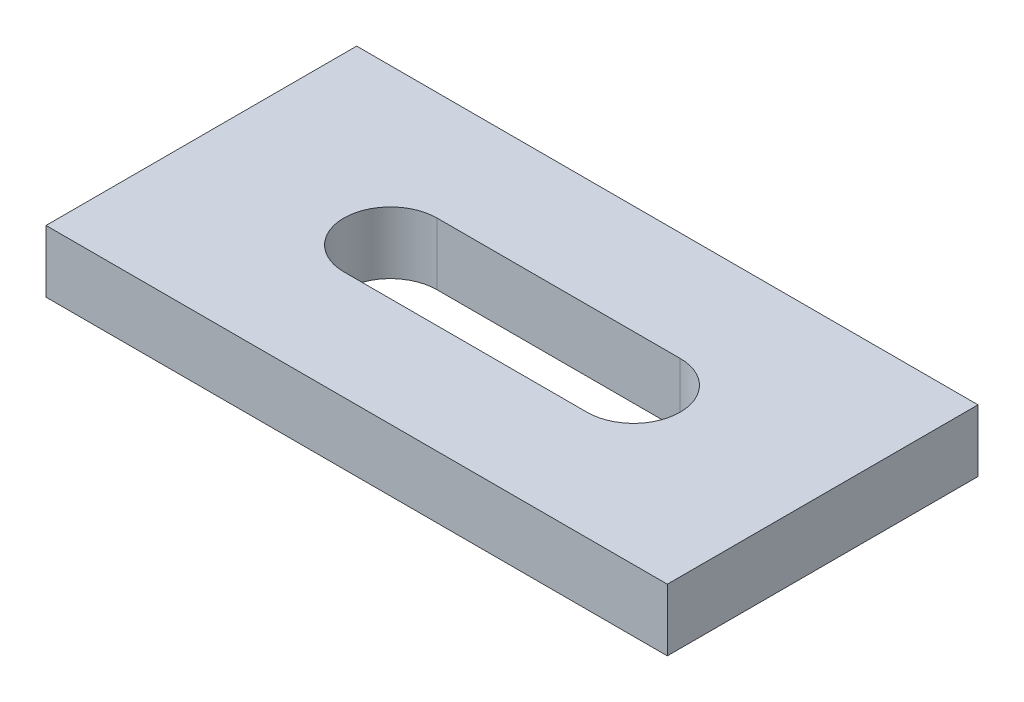
ISO-10303-21;
HEADER;
FILE_DESCRIPTION(('STEP AP214'),'2;1');
FILE_NAME('part.step','',(''),(''),'','','');
FILE_SCHEMA(('AUTOMOTIVE_DESIGN { 1 0 10303 214 1 1 1 1 }'));
ENDSEC;
DATA;
#1=APPLICATION_CONTEXT('core data for automotive mechanical design processes');
#2=APPLICATION_PROTOCOL_DEFINITION('international standard','automotive_design',2000,#1);
#3=PRODUCT_CONTEXT('',#1,'mechanical');
#4=PRODUCT('Part','Part','',(#3));
#5=PRODUCT_RELATED_PRODUCT_CATEGORY('part','',(#4));
#6=PRODUCT_DEFINITION_FORMATION('','',#4);
#7=PRODUCT_DEFINITION_CONTEXT('part definition',#1,'design');
#8=PRODUCT_DEFINITION('design','',#6,#7);
#9=PRODUCT_DEFINITION_SHAPE('','',#8);
#10=(LENGTH_UNIT() NAMED_UNIT(*) SI_UNIT(.MILLI.,.METRE.));
#11=(NAMED_UNIT(*) PLANE_ANGLE_UNIT() SI_UNIT($,.RADIAN.));
#12=(NAMED_UNIT(*) SI_UNIT($,.STERADIAN.) SOLID_ANGLE_UNIT());
#13=UNCERTAINTY_MEASURE_WITH_UNIT(LENGTH_MEASURE(1.E-05),#10,'distance_accuracy_value','');
#14=(GEOMETRIC_REPRESENTATION_CONTEXT(3) GLOBAL_UNCERTAINTY_ASSIGNED_CONTEXT((#13)) GLOBAL_UNIT_ASSIGNED_CONTEXT((#10,
#11,#12)) REPRESENTATION_CONTEXT('',''));
#15=CARTESIAN_POINT('',(0.,0.,0.));
#16=DIRECTION('',(0.,0.,1.));
#17=DIRECTION('',(1.,0.,0.));
#18=AXIS2_PLACEMENT_3D('',#15,#16,#17);
#19=CARTESIAN_POINT('',(0.,20.,0.));
#20=DIRECTION('',(0.,-1.,0.));
#21=DIRECTION('',(0.,0.,-1.));
#22=AXIS2_PLACEMENT_3D('',#19,#20,#21);
#23=PLANE('',#22);
#24=DIRECTION('',(0.,0.,-1.));
#25=VECTOR('',#24,1.);
#26=CARTESIAN_POINT('',(100.,20.,50.));
#27=LINE('',#26,#25);
#28=CARTESIAN_POINT('',(100.,20.,50.));
#29=VERTEX_POINT('',#28);
#30=CARTESIAN_POINT('',(100.,20.,-50.));
#31=VERTEX_POINT('',#30);
#32=EDGE_CURVE('E153',#29,#31,#27,.T.);
#33=ORIENTED_EDGE('',*,*,#32,.T.);
#34=DIRECTION('',(-1.,0.,0.));
#35=VECTOR('',#34,1.);
#36=CARTESIAN_POINT('',(-100.,20.,-50.));
#37=LINE('',#36,#35);
#38=CARTESIAN_POINT('',(-100.,20.,-50.));
#39=VERTEX_POINT('',#38);
#40=EDGE_CURVE('E157',#31,#39,#37,.T.);
#41=ORIENTED_EDGE('',*,*,#40,.T.);
#42=DIRECTION('',(0.,0.,1.));
#43=VECTOR('',#42,1.);
#44=CARTESIAN_POINT('',(-100.,20.,50.));
#45=LINE('',#44,#43);
#46=CARTESIAN_POINT('',(-100.,20.,50.));
#47=VERTEX_POINT('',#46);
#48=EDGE_CURVE('E161',#39,#47,#45,.T.);
#49=ORIENTED_EDGE('',*,*,#48,.T.);
#50=DIRECTION('',(1.,0.,0.));
#51=VECTOR('',#50,1.);
#52=CARTESIAN_POINT('',(-100.,20.,50.));
#53=LINE('',#52,#51);
#54=EDGE_CURVE('E164',#47,#29,#53,.T.);
#55=ORIENTED_EDGE('',*,*,#54,.T.);
#56=EDGE_LOOP('',(#33,#41,#49,#55));
#57=FACE_BOUND('',#56,.T.);
#58=CARTESIAN_POINT('',(-39.1304347826087,20.,0.));
#59=DIRECTION('',(0.,1.,0.));
#60=DIRECTION('',(0.,0.,1.));
#61=AXIS2_PLACEMENT_3D('',#58,#59,#60);
#62=CIRCLE('',#61,15.);
#63=CARTESIAN_POINT('',(-39.1304347826087,20.,-15.));
#64=VERTEX_POINT('',#63);
#65=CARTESIAN_POINT('',(-39.1304347826087,20.,15.));
#66=VERTEX_POINT('',#65);
#67=EDGE_CURVE('E105',#64,#66,#62,.T.);
#68=ORIENTED_EDGE('',*,*,#67,.F.);
#69=DIRECTION('',(-1.,0.,0.));
#70=VECTOR('',#69,1.);
#71=CARTESIAN_POINT('',(-39.1304347826087,20.,-15.));
#72=LINE('',#71,#70);
#73=CARTESIAN_POINT('',(39.1304347826087,20.,-15.));
#74=VERTEX_POINT('',#73);
#75=EDGE_CURVE('E131',#74,#64,#72,.T.);
#76=ORIENTED_EDGE('',*,*,#75,.F.);
#77=CARTESIAN_POINT('',(39.1304347826087,20.,0.));
#78=DIRECTION('',(0.,1.,0.));
#79=DIRECTION('',(0.,0.,1.));
#80=AXIS2_PLACEMENT_3D('',#77,#78,#79);
#81=CIRCLE('',#80,15.);
#82=CARTESIAN_POINT('',(39.1304347826087,20.,15.));
#83=VERTEX_POINT('',#82);
#84=EDGE_CURVE('E127',#83,#74,#81,.T.);
#85=ORIENTED_EDGE('',*,*,#84,.F.);
#86=DIRECTION('',(1.,0.,0.));
#87=VECTOR('',#86,1.);
#88=CARTESIAN_POINT('',(-39.1304347826087,20.,15.));
#89=LINE('',#88,#87);
#90=EDGE_CURVE('E114',#66,#83,#89,.T.);
#91=ORIENTED_EDGE('',*,*,#90,.F.);
#92=EDGE_LOOP('',(#68,#76,#85,#91));
#93=FACE_BOUND('',#92,.T.);
#94=ADVANCED_FACE('F39',(#57,#93),#23,.F.);
#95=CARTESIAN_POINT('',(0.,0.,0.));
#96=DIRECTION('',(0.,-1.,0.));
#97=DIRECTION('',(0.,0.,-1.));
#98=AXIS2_PLACEMENT_3D('',#95,#96,#97);
#99=PLANE('',#98);
#100=DIRECTION('',(0.,0.,-1.));
#101=VECTOR('',#100,1.);
#102=CARTESIAN_POINT('',(100.,0.,50.));
#103=LINE('',#102,#101);
#104=CARTESIAN_POINT('',(100.,0.,50.));
#105=VERTEX_POINT('',#104);
#106=CARTESIAN_POINT('',(100.,0.,-50.));
#107=VERTEX_POINT('',#106);
#108=EDGE_CURVE('E123',#105,#107,#103,.T.);
#109=ORIENTED_EDGE('',*,*,#108,.F.);
#110=DIRECTION('',(1.,0.,0.));
#111=VECTOR('',#110,1.);
#112=CARTESIAN_POINT('',(-100.,0.,50.));
#113=LINE('',#112,#111);
#114=CARTESIAN_POINT('',(-100.,0.,50.));
#115=VERTEX_POINT('',#114);
#116=EDGE_CURVE('E158',#115,#105,#113,.T.);
#117=ORIENTED_EDGE('',*,*,#116,.F.);
#118=DIRECTION('',(0.,0.,1.));
#119=VECTOR('',#118,1.);
#120=CARTESIAN_POINT('',(-100.,0.,50.));
#121=LINE('',#120,#119);
#122=CARTESIAN_POINT('',(-100.,0.,-50.));
#123=VERTEX_POINT('',#122);
#124=EDGE_CURVE('E174',#123,#115,#121,.T.);
#125=ORIENTED_EDGE('',*,*,#124,.F.);
#126=DIRECTION('',(-1.,0.,0.));
#127=VECTOR('',#126,1.);
#128=CARTESIAN_POINT('',(-100.,0.,-50.));
#129=LINE('',#128,#127);
#130=EDGE_CURVE('E171',#107,#123,#129,.T.);
#131=ORIENTED_EDGE('',*,*,#130,.F.);
#132=EDGE_LOOP('',(#109,#117,#125,#131));
#133=FACE_BOUND('',#132,.T.);
#134=DIRECTION('',(-1.,0.,0.));
#135=VECTOR('',#134,1.);
#136=CARTESIAN_POINT('',(-39.1304347826087,0.,-15.));
#137=LINE('',#136,#135);
#138=CARTESIAN_POINT('',(39.1304347826087,0.,-15.));
#139=VERTEX_POINT('',#138);
#140=CARTESIAN_POINT('',(-39.1304347826087,0.,-15.));
#141=VERTEX_POINT('',#140);
#142=EDGE_CURVE('E115',#139,#141,#137,.T.);
#143=ORIENTED_EDGE('',*,*,#142,.T.);
#144=CARTESIAN_POINT('',(-39.1304347826087,0.,0.));
#145=DIRECTION('',(0.,1.,0.));
#146=DIRECTION('',(0.,0.,1.));
#147=AXIS2_PLACEMENT_3D('',#144,#145,#146);
#148=CIRCLE('',#147,15.);
#149=CARTESIAN_POINT('',(-39.1304347826087,0.,15.));
#150=VERTEX_POINT('',#149);
#151=EDGE_CURVE('E63',#141,#150,#148,.T.);
#152=ORIENTED_EDGE('',*,*,#151,.T.);
#153=DIRECTION('',(1.,0.,0.));
#154=VECTOR('',#153,1.);
#155=CARTESIAN_POINT('',(-39.1304347826087,0.,15.));
#156=LINE('',#155,#154);
#157=CARTESIAN_POINT('',(39.1304347826087,0.,15.));
#158=VERTEX_POINT('',#157);
#159=EDGE_CURVE('E121',#150,#158,#156,.T.);
#160=ORIENTED_EDGE('',*,*,#159,.T.);
#161=CARTESIAN_POINT('',(39.1304347826087,0.,0.));
#162=DIRECTION('',(0.,1.,0.));
#163=DIRECTION('',(0.,0.,1.));
#164=AXIS2_PLACEMENT_3D('',#161,#162,#163);
#165=CIRCLE('',#164,15.);
#166=EDGE_CURVE('E140',#158,#139,#165,.T.);
#167=ORIENTED_EDGE('',*,*,#166,.T.);
#168=EDGE_LOOP('',(#143,#152,#160,#167));
#169=FACE_BOUND('',#168,.T.);
#170=ADVANCED_FACE('F197',(#133,#169),#99,.T.);
#171=CARTESIAN_POINT('',(100.,20.,50.));
#172=DIRECTION('',(-1.,0.,0.));
#173=DIRECTION('',(0.,0.,1.));
#174=AXIS2_PLACEMENT_3D('',#171,#172,#173);
#175=PLANE('',#174);
#176=ORIENTED_EDGE('',*,*,#108,.T.);
#177=DIRECTION('',(0.,-1.,0.));
#178=VECTOR('',#177,1.);
#179=CARTESIAN_POINT('',(100.,20.,-50.));
#180=LINE('',#179,#178);
#181=EDGE_CURVE('E11',#31,#107,#180,.T.);
#182=ORIENTED_EDGE('',*,*,#181,.F.);
#183=ORIENTED_EDGE('',*,*,#32,.F.);
#184=DIRECTION('',(0.,-1.,0.));
#185=VECTOR('',#184,1.);
#186=CARTESIAN_POINT('',(100.,20.,50.));
#187=LINE('',#186,#185);
#188=EDGE_CURVE('E167',#29,#105,#187,.T.);
#189=ORIENTED_EDGE('',*,*,#188,.T.);
#190=EDGE_LOOP('',(#176,#182,#183,#189));
#191=FACE_BOUND('',#190,.T.);
#192=ADVANCED_FACE('F41',(#191),#175,.F.);
#193=CARTESIAN_POINT('',(-100.,20.,-50.));
#194=DIRECTION('',(0.,0.,1.));
#195=DIRECTION('',(1.,0.,0.));
#196=AXIS2_PLACEMENT_3D('',#193,#194,#195);
#197=PLANE('',#196);
#198=ORIENTED_EDGE('',*,*,#130,.T.);
#199=DIRECTION('',(0.,-1.,0.));
#200=VECTOR('',#199,1.);
#201=CARTESIAN_POINT('',(-100.,20.,-50.));
#202=LINE('',#201,#200);
#203=EDGE_CURVE('E48',#39,#123,#202,.T.);
#204=ORIENTED_EDGE('',*,*,#203,.F.);
#205=ORIENTED_EDGE('',*,*,#40,.F.);
#206=ORIENTED_EDGE('',*,*,#181,.T.);
#207=EDGE_LOOP('',(#198,#204,#205,#206));
#208=FACE_BOUND('',#207,.T.);
#209=ADVANCED_FACE('F207',(#208),#197,.F.);
#210=CARTESIAN_POINT('',(-100.,20.,50.));
#211=DIRECTION('',(1.,0.,0.));
#212=DIRECTION('',(0.,0.,-1.));
#213=AXIS2_PLACEMENT_3D('',#210,#211,#212);
#214=PLANE('',#213);
#215=ORIENTED_EDGE('',*,*,#124,.T.);
#216=DIRECTION('',(0.,-1.,0.));
#217=VECTOR('',#216,1.);
#218=CARTESIAN_POINT('',(-100.,20.,50.));
#219=LINE('',#218,#217);
#220=EDGE_CURVE('E182',#47,#115,#219,.T.);
#221=ORIENTED_EDGE('',*,*,#220,.F.);
#222=ORIENTED_EDGE('',*,*,#48,.F.);
#223=ORIENTED_EDGE('',*,*,#203,.T.);
#224=EDGE_LOOP('',(#215,#221,#222,#223));
#225=FACE_BOUND('',#224,.T.);
#226=ADVANCED_FACE('F191',(#225),#214,.F.);
#227=CARTESIAN_POINT('',(-100.,20.,50.));
#228=DIRECTION('',(0.,0.,-1.));
#229=DIRECTION('',(-1.,0.,0.));
#230=AXIS2_PLACEMENT_3D('',#227,#228,#229);
#231=PLANE('',#230);
#232=ORIENTED_EDGE('',*,*,#116,.T.);
#233=ORIENTED_EDGE('',*,*,#188,.F.);
#234=ORIENTED_EDGE('',*,*,#54,.F.);
#235=ORIENTED_EDGE('',*,*,#220,.T.);
#236=EDGE_LOOP('',(#232,#233,#234,#235));
#237=FACE_BOUND('',#236,.T.);
#238=ADVANCED_FACE('F201',(#237),#231,.F.);
#239=CARTESIAN_POINT('',(-39.1304347826087,20.,0.));
#240=DIRECTION('',(0.,-1.,0.));
#241=DIRECTION('',(0.,0.,-1.));
#242=AXIS2_PLACEMENT_3D('',#239,#240,#241);
#243=CYLINDRICAL_SURFACE('',#242,15.);
#244=ORIENTED_EDGE('',*,*,#151,.F.);
#245=DIRECTION('',(0.,-1.,0.));
#246=VECTOR('',#245,1.);
#247=CARTESIAN_POINT('',(-39.1304347826087,20.,-15.));
#248=LINE('',#247,#246);
#249=EDGE_CURVE('E109',#64,#141,#248,.T.);
#250=ORIENTED_EDGE('',*,*,#249,.F.);
#251=ORIENTED_EDGE('',*,*,#67,.T.);
#252=DIRECTION('',(0.,-1.,0.));
#253=VECTOR('',#252,1.);
#254=CARTESIAN_POINT('',(-39.1304347826087,20.,15.));
#255=LINE('',#254,#253);
#256=EDGE_CURVE('E108',#66,#150,#255,.T.);
#257=ORIENTED_EDGE('',*,*,#256,.T.);
#258=EDGE_LOOP('',(#244,#250,#251,#257));
#259=FACE_BOUND('',#258,.T.);
#260=ADVANCED_FACE('F107',(#259),#243,.F.);
#261=CARTESIAN_POINT('',(-39.1304347826087,20.,15.));
#262=DIRECTION('',(0.,0.,-1.));
#263=DIRECTION('',(-1.,0.,0.));
#264=AXIS2_PLACEMENT_3D('',#261,#262,#263);
#265=PLANE('',#264);
#266=ORIENTED_EDGE('',*,*,#159,.F.);
#267=ORIENTED_EDGE('',*,*,#256,.F.);
#268=ORIENTED_EDGE('',*,*,#90,.T.);
#269=DIRECTION('',(0.,-1.,0.));
#270=VECTOR('',#269,1.);
#271=CARTESIAN_POINT('',(39.1304347826087,20.,15.));
#272=LINE('',#271,#270);
#273=EDGE_CURVE('E124',#83,#158,#272,.T.);
#274=ORIENTED_EDGE('',*,*,#273,.T.);
#275=EDGE_LOOP('',(#266,#267,#268,#274));
#276=FACE_BOUND('',#275,.T.);
#277=ADVANCED_FACE('F118',(#276),#265,.T.);
#278=CARTESIAN_POINT('',(39.1304347826087,20.,0.));
#279=DIRECTION('',(0.,-1.,0.));
#280=DIRECTION('',(0.,0.,-1.));
#281=AXIS2_PLACEMENT_3D('',#278,#279,#280);
#282=CYLINDRICAL_SURFACE('',#281,15.);
#283=ORIENTED_EDGE('',*,*,#166,.F.);
#284=ORIENTED_EDGE('',*,*,#273,.F.);
#285=ORIENTED_EDGE('',*,*,#84,.T.);
#286=DIRECTION('',(0.,-1.,0.));
#287=VECTOR('',#286,1.);
#288=CARTESIAN_POINT('',(39.1304347826087,20.,-15.));
#289=LINE('',#288,#287);
#290=EDGE_CURVE('E55',#74,#139,#289,.T.);
#291=ORIENTED_EDGE('',*,*,#290,.T.);
#292=EDGE_LOOP('',(#283,#284,#285,#291));
#293=FACE_BOUND('',#292,.T.);
#294=ADVANCED_FACE('F230',(#293),#282,.F.);
#295=CARTESIAN_POINT('',(-39.1304347826087,20.,-15.));
#296=DIRECTION('',(0.,0.,1.));
#297=DIRECTION('',(1.,0.,0.));
#298=AXIS2_PLACEMENT_3D('',#295,#296,#297);
#299=PLANE('',#298);
#300=ORIENTED_EDGE('',*,*,#142,.F.);
#301=ORIENTED_EDGE('',*,*,#290,.F.);
#302=ORIENTED_EDGE('',*,*,#75,.T.);
#303=ORIENTED_EDGE('',*,*,#249,.T.);
#304=EDGE_LOOP('',(#300,#301,#302,#303));
#305=FACE_BOUND('',#304,.T.);
#306=ADVANCED_FACE('F234',(#305),#299,.T.);
#307=CLOSED_SHELL('',(#94,#170,#192,#209,#226,#238,#260,#277,#294,#306));
#308=MANIFOLD_SOLID_BREP('B2',#307);
#309=ADVANCED_BREP_SHAPE_REPRESENTATION('',(#18,#308),#14);
#310=SHAPE_DEFINITION_REPRESENTATION(#9,#309);
ENDSEC;
END-ISO-10303-21;
